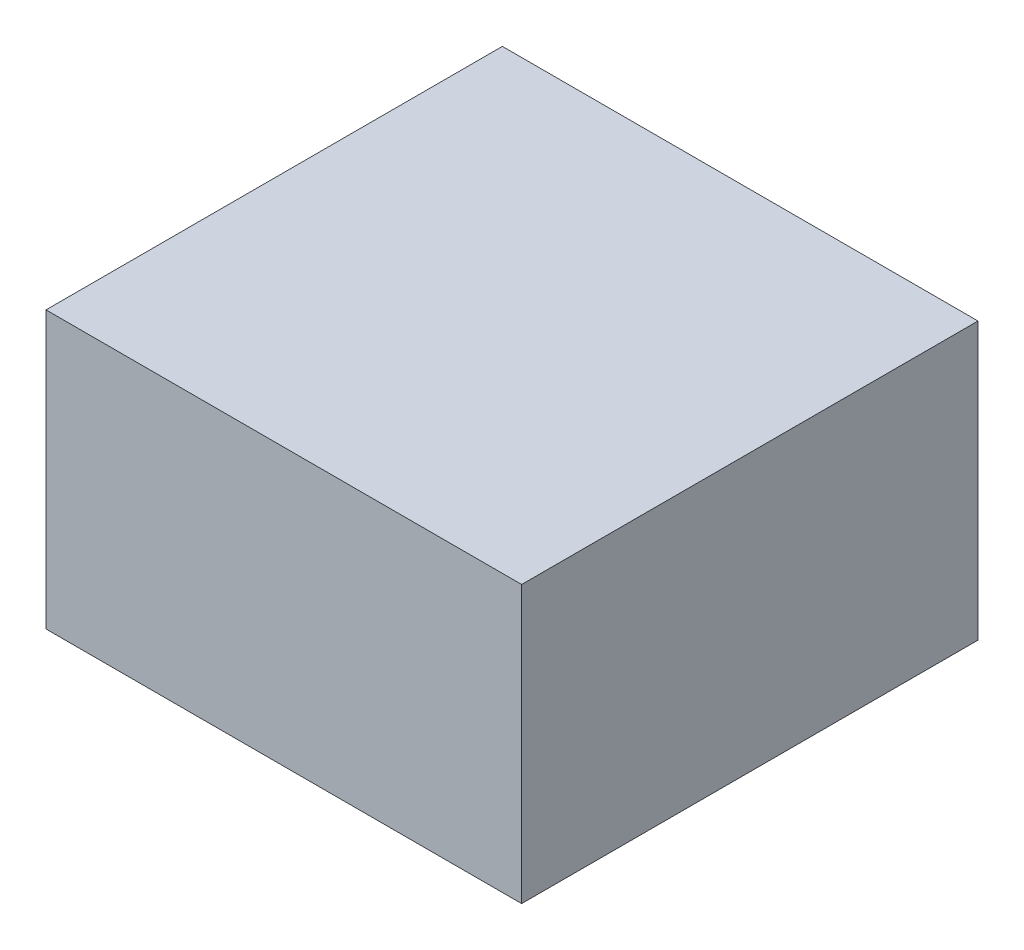
ISO-10303-21;
HEADER;
FILE_DESCRIPTION(('STEP AP214'),'2;1');
FILE_NAME('part.step','',(''),(''),'','','');
FILE_SCHEMA(('AUTOMOTIVE_DESIGN { 1 0 10303 214 1 1 1 1 }'));
ENDSEC;
DATA;
#1=APPLICATION_CONTEXT('core data for automotive mechanical design processes');
#2=APPLICATION_PROTOCOL_DEFINITION('international standard','automotive_design',2000,#1);
#3=PRODUCT_CONTEXT('',#1,'mechanical');
#4=PRODUCT('Part','Part','',(#3));
#5=PRODUCT_RELATED_PRODUCT_CATEGORY('part','',(#4));
#6=PRODUCT_DEFINITION_FORMATION('','',#4);
#7=PRODUCT_DEFINITION_CONTEXT('part definition',#1,'design');
#8=PRODUCT_DEFINITION('design','',#6,#7);
#9=PRODUCT_DEFINITION_SHAPE('','',#8);
#10=(LENGTH_UNIT() NAMED_UNIT(*) SI_UNIT(.MILLI.,.METRE.));
#11=(NAMED_UNIT(*) PLANE_ANGLE_UNIT() SI_UNIT($,.RADIAN.));
#12=(NAMED_UNIT(*) SI_UNIT($,.STERADIAN.) SOLID_ANGLE_UNIT());
#13=UNCERTAINTY_MEASURE_WITH_UNIT(LENGTH_MEASURE(1.E-05),#10,'distance_accuracy_value','');
#14=(GEOMETRIC_REPRESENTATION_CONTEXT(3) GLOBAL_UNCERTAINTY_ASSIGNED_CONTEXT((#13)) GLOBAL_UNIT_ASSIGNED_CONTEXT((#10,
#11,#12)) REPRESENTATION_CONTEXT('',''));
#15=CARTESIAN_POINT('',(0.,0.,0.));
#16=DIRECTION('',(0.,0.,1.));
#17=DIRECTION('',(1.,0.,0.));
#18=AXIS2_PLACEMENT_3D('',#15,#16,#17);
#19=CARTESIAN_POINT('',(0.,43.,0.));
#20=DIRECTION('',(1.,0.,0.));
#21=DIRECTION('',(0.,0.,-1.));
#22=AXIS2_PLACEMENT_3D('',#19,#20,#21);
#23=PLANE('',#22);
#24=DIRECTION('',(0.,0.,1.));
#25=VECTOR('',#24,1.);
#26=CARTESIAN_POINT('',(0.,0.,0.));
#27=LINE('',#26,#25);
#28=CARTESIAN_POINT('',(0.,0.,-71.));
#29=VERTEX_POINT('',#28);
#30=CARTESIAN_POINT('',(0.,0.,0.));
#31=VERTEX_POINT('',#30);
#32=EDGE_CURVE('E113',#29,#31,#27,.T.);
#33=ORIENTED_EDGE('',*,*,#32,.T.);
#34=DIRECTION('',(0.,-1.,0.));
#35=VECTOR('',#34,1.);
#36=CARTESIAN_POINT('',(0.,43.,0.));
#37=LINE('',#36,#35);
#38=CARTESIAN_POINT('',(0.,43.,0.));
#39=VERTEX_POINT('',#38);
#40=EDGE_CURVE('E11',#39,#31,#37,.T.);
#41=ORIENTED_EDGE('',*,*,#40,.F.);
#42=DIRECTION('',(0.,0.,1.));
#43=VECTOR('',#42,1.);
#44=CARTESIAN_POINT('',(0.,43.,0.));
#45=LINE('',#44,#43);
#46=CARTESIAN_POINT('',(0.,43.,-71.));
#47=VERTEX_POINT('',#46);
#48=EDGE_CURVE('E97',#47,#39,#45,.T.);
#49=ORIENTED_EDGE('',*,*,#48,.F.);
#50=DIRECTION('',(0.,-1.,0.));
#51=VECTOR('',#50,1.);
#52=CARTESIAN_POINT('',(0.,43.,-71.));
#53=LINE('',#52,#51);
#54=EDGE_CURVE('E109',#47,#29,#53,.T.);
#55=ORIENTED_EDGE('',*,*,#54,.T.);
#56=EDGE_LOOP('',(#33,#41,#49,#55));
#57=FACE_BOUND('',#56,.T.);
#58=ADVANCED_FACE('F45',(#57),#23,.F.);
#59=CARTESIAN_POINT('',(0.,43.,0.));
#60=DIRECTION('',(0.,0.,-1.));
#61=DIRECTION('',(-1.,0.,0.));
#62=AXIS2_PLACEMENT_3D('',#59,#60,#61);
#63=PLANE('',#62);
#64=DIRECTION('',(1.,0.,0.));
#65=VECTOR('',#64,1.);
#66=CARTESIAN_POINT('',(0.,0.,0.));
#67=LINE('',#66,#65);
#68=CARTESIAN_POINT('',(74.,0.,0.));
#69=VERTEX_POINT('',#68);
#70=EDGE_CURVE('E102',#31,#69,#67,.T.);
#71=ORIENTED_EDGE('',*,*,#70,.T.);
#72=DIRECTION('',(0.,-1.,0.));
#73=VECTOR('',#72,1.);
#74=CARTESIAN_POINT('',(74.,43.,0.));
#75=LINE('',#74,#73);
#76=CARTESIAN_POINT('',(74.,43.,0.));
#77=VERTEX_POINT('',#76);
#78=EDGE_CURVE('E54',#77,#69,#75,.T.);
#79=ORIENTED_EDGE('',*,*,#78,.F.);
#80=DIRECTION('',(1.,0.,0.));
#81=VECTOR('',#80,1.);
#82=CARTESIAN_POINT('',(0.,43.,0.));
#83=LINE('',#82,#81);
#84=EDGE_CURVE('E92',#39,#77,#83,.T.);
#85=ORIENTED_EDGE('',*,*,#84,.F.);
#86=ORIENTED_EDGE('',*,*,#40,.T.);
#87=EDGE_LOOP('',(#71,#79,#85,#86));
#88=FACE_BOUND('',#87,.T.);
#89=ADVANCED_FACE('F101',(#88),#63,.F.);
#90=CARTESIAN_POINT('',(74.,43.,0.));
#91=DIRECTION('',(-1.,0.,0.));
#92=DIRECTION('',(0.,0.,1.));
#93=AXIS2_PLACEMENT_3D('',#90,#91,#92);
#94=PLANE('',#93);
#95=DIRECTION('',(0.,0.,-1.));
#96=VECTOR('',#95,1.);
#97=CARTESIAN_POINT('',(74.,0.,0.));
#98=LINE('',#97,#96);
#99=CARTESIAN_POINT('',(74.,0.,-71.));
#100=VERTEX_POINT('',#99);
#101=EDGE_CURVE('E79',#69,#100,#98,.T.);
#102=ORIENTED_EDGE('',*,*,#101,.T.);
#103=DIRECTION('',(0.,-1.,0.));
#104=VECTOR('',#103,1.);
#105=CARTESIAN_POINT('',(74.,43.,-71.));
#106=LINE('',#105,#104);
#107=CARTESIAN_POINT('',(74.,43.,-71.));
#108=VERTEX_POINT('',#107);
#109=EDGE_CURVE('E104',#108,#100,#106,.T.);
#110=ORIENTED_EDGE('',*,*,#109,.F.);
#111=DIRECTION('',(0.,0.,-1.));
#112=VECTOR('',#111,1.);
#113=CARTESIAN_POINT('',(74.,43.,0.));
#114=LINE('',#113,#112);
#115=EDGE_CURVE('E95',#77,#108,#114,.T.);
#116=ORIENTED_EDGE('',*,*,#115,.F.);
#117=ORIENTED_EDGE('',*,*,#78,.T.);
#118=EDGE_LOOP('',(#102,#110,#116,#117));
#119=FACE_BOUND('',#118,.T.);
#120=ADVANCED_FACE('F105',(#119),#94,.F.);
#121=CARTESIAN_POINT('',(0.,43.,-71.));
#122=DIRECTION('',(0.,0.,1.));
#123=DIRECTION('',(1.,0.,0.));
#124=AXIS2_PLACEMENT_3D('',#121,#122,#123);
#125=PLANE('',#124);
#126=DIRECTION('',(-1.,0.,0.));
#127=VECTOR('',#126,1.);
#128=CARTESIAN_POINT('',(0.,0.,-71.));
#129=LINE('',#128,#127);
#130=EDGE_CURVE('E85',#100,#29,#129,.T.);
#131=ORIENTED_EDGE('',*,*,#130,.T.);
#132=ORIENTED_EDGE('',*,*,#54,.F.);
#133=DIRECTION('',(-1.,0.,0.));
#134=VECTOR('',#133,1.);
#135=CARTESIAN_POINT('',(0.,43.,-71.));
#136=LINE('',#135,#134);
#137=EDGE_CURVE('E62',#108,#47,#136,.T.);
#138=ORIENTED_EDGE('',*,*,#137,.F.);
#139=ORIENTED_EDGE('',*,*,#109,.T.);
#140=EDGE_LOOP('',(#131,#132,#138,#139));
#141=FACE_BOUND('',#140,.T.);
#142=ADVANCED_FACE('F126',(#141),#125,.F.);
#143=CARTESIAN_POINT('',(0.,43.,0.));
#144=DIRECTION('',(0.,-1.,0.));
#145=DIRECTION('',(0.,0.,-1.));
#146=AXIS2_PLACEMENT_3D('',#143,#144,#145);
#147=PLANE('',#146);
#148=ORIENTED_EDGE('',*,*,#48,.T.);
#149=ORIENTED_EDGE('',*,*,#84,.T.);
#150=ORIENTED_EDGE('',*,*,#115,.T.);
#151=ORIENTED_EDGE('',*,*,#137,.T.);
#152=EDGE_LOOP('',(#148,#149,#150,#151));
#153=FACE_BOUND('',#152,.T.);
#154=ADVANCED_FACE('F93',(#153),#147,.F.);
#155=CARTESIAN_POINT('',(0.,0.,0.));
#156=DIRECTION('',(0.,-1.,0.));
#157=DIRECTION('',(0.,0.,-1.));
#158=AXIS2_PLACEMENT_3D('',#155,#156,#157);
#159=PLANE('',#158);
#160=ORIENTED_EDGE('',*,*,#32,.F.);
#161=ORIENTED_EDGE('',*,*,#130,.F.);
#162=ORIENTED_EDGE('',*,*,#101,.F.);
#163=ORIENTED_EDGE('',*,*,#70,.F.);
#164=EDGE_LOOP('',(#160,#161,#162,#163));
#165=FACE_BOUND('',#164,.T.);
#166=ADVANCED_FACE('F129',(#165),#159,.T.);
#167=CLOSED_SHELL('',(#58,#89,#120,#142,#154,#166));
#168=MANIFOLD_SOLID_BREP('B2',#167);
#169=ADVANCED_BREP_SHAPE_REPRESENTATION('',(#18,#168),#14);
#170=SHAPE_DEFINITION_REPRESENTATION(#9,#169);
ENDSEC;
END-ISO-10303-21;
